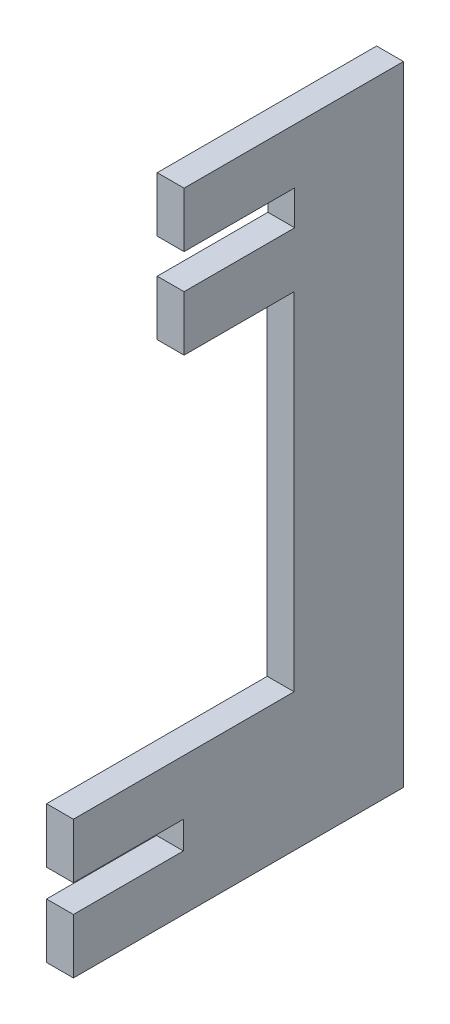
ISO-10303-21;
HEADER;
FILE_DESCRIPTION(('STEP AP214'),'2;1');
FILE_NAME('part.step','',(''),(''),'','','');
FILE_SCHEMA(('AUTOMOTIVE_DESIGN { 1 0 10303 214 1 1 1 1 }'));
ENDSEC;
DATA;
#1=APPLICATION_CONTEXT('core data for automotive mechanical design processes');
#2=APPLICATION_PROTOCOL_DEFINITION('international standard','automotive_design',2000,#1);
#3=PRODUCT_CONTEXT('',#1,'mechanical');
#4=PRODUCT('Part','Part','',(#3));
#5=PRODUCT_RELATED_PRODUCT_CATEGORY('part','',(#4));
#6=PRODUCT_DEFINITION_FORMATION('','',#4);
#7=PRODUCT_DEFINITION_CONTEXT('part definition',#1,'design');
#8=PRODUCT_DEFINITION('design','',#6,#7);
#9=PRODUCT_DEFINITION_SHAPE('','',#8);
#10=(LENGTH_UNIT() NAMED_UNIT(*) SI_UNIT(.MILLI.,.METRE.));
#11=(NAMED_UNIT(*) PLANE_ANGLE_UNIT() SI_UNIT($,.RADIAN.));
#12=(NAMED_UNIT(*) SI_UNIT($,.STERADIAN.) SOLID_ANGLE_UNIT());
#13=UNCERTAINTY_MEASURE_WITH_UNIT(LENGTH_MEASURE(1.E-05),#10,'distance_accuracy_value','');
#14=(GEOMETRIC_REPRESENTATION_CONTEXT(3) GLOBAL_UNCERTAINTY_ASSIGNED_CONTEXT((#13)) GLOBAL_UNIT_ASSIGNED_CONTEXT((#10,
#11,#12)) REPRESENTATION_CONTEXT('',''));
#15=CARTESIAN_POINT('',(0.,0.,0.));
#16=DIRECTION('',(0.,0.,1.));
#17=DIRECTION('',(1.,0.,0.));
#18=AXIS2_PLACEMENT_3D('',#15,#16,#17);
#19=CARTESIAN_POINT('',(3.0988,1.5875,12.7));
#20=DIRECTION('',(0.,0.,-1.));
#21=DIRECTION('',(0.,1.,0.));
#22=AXIS2_PLACEMENT_3D('',#19,#20,#21);
#23=PLANE('',#22);
#24=DIRECTION('',(0.,-1.,0.));
#25=VECTOR('',#24,1.);
#26=CARTESIAN_POINT('',(0.,1.5875,12.7));
#27=LINE('',#26,#25);
#28=CARTESIAN_POINT('',(0.,7.9375,12.7));
#29=VERTEX_POINT('',#28);
#30=CARTESIAN_POINT('',(0.,1.5875,12.7));
#31=VERTEX_POINT('',#30);
#32=EDGE_CURVE('E177',#29,#31,#27,.T.);
#33=ORIENTED_EDGE('',*,*,#32,.T.);
#34=DIRECTION('',(-1.,0.,0.));
#35=VECTOR('',#34,1.);
#36=CARTESIAN_POINT('',(3.0988,1.5875,12.7));
#37=LINE('',#36,#35);
#38=CARTESIAN_POINT('',(3.0988,1.5875,12.7));
#39=VERTEX_POINT('',#38);
#40=EDGE_CURVE('E11',#39,#31,#37,.T.);
#41=ORIENTED_EDGE('',*,*,#40,.F.);
#42=DIRECTION('',(0.,-1.,0.));
#43=VECTOR('',#42,1.);
#44=CARTESIAN_POINT('',(3.0988,1.5875,12.7));
#45=LINE('',#44,#43);
#46=CARTESIAN_POINT('',(3.0988,7.9375,12.7));
#47=VERTEX_POINT('',#46);
#48=EDGE_CURVE('E207',#47,#39,#45,.T.);
#49=ORIENTED_EDGE('',*,*,#48,.F.);
#50=DIRECTION('',(-1.,0.,0.));
#51=VECTOR('',#50,1.);
#52=CARTESIAN_POINT('',(3.0988,7.9375,12.7));
#53=LINE('',#52,#51);
#54=EDGE_CURVE('E173',#47,#29,#53,.T.);
#55=ORIENTED_EDGE('',*,*,#54,.T.);
#56=EDGE_LOOP('',(#33,#41,#49,#55));
#57=FACE_BOUND('',#56,.T.);
#58=ADVANCED_FACE('F33',(#57),#23,.F.);
#59=CARTESIAN_POINT('',(3.0988,1.5875,12.7));
#60=DIRECTION('',(0.,1.,0.));
#61=DIRECTION('',(0.,0.,1.));
#62=AXIS2_PLACEMENT_3D('',#59,#60,#61);
#63=PLANE('',#62);
#64=DIRECTION('',(0.,0.,-1.));
#65=VECTOR('',#64,1.);
#66=CARTESIAN_POINT('',(0.,1.5875,12.7));
#67=LINE('',#66,#65);
#68=CARTESIAN_POINT('',(0.,1.5875,0.));
#69=VERTEX_POINT('',#68);
#70=EDGE_CURVE('E180',#31,#69,#67,.T.);
#71=ORIENTED_EDGE('',*,*,#70,.T.);
#72=DIRECTION('',(-1.,0.,0.));
#73=VECTOR('',#72,1.);
#74=CARTESIAN_POINT('',(3.0988,1.5875,0.));
#75=LINE('',#74,#73);
#76=CARTESIAN_POINT('',(3.0988,1.5875,0.));
#77=VERTEX_POINT('',#76);
#78=EDGE_CURVE('E41',#77,#69,#75,.T.);
#79=ORIENTED_EDGE('',*,*,#78,.F.);
#80=DIRECTION('',(0.,0.,-1.));
#81=VECTOR('',#80,1.);
#82=CARTESIAN_POINT('',(3.0988,1.5875,12.7));
#83=LINE('',#82,#81);
#84=EDGE_CURVE('E116',#39,#77,#83,.T.);
#85=ORIENTED_EDGE('',*,*,#84,.F.);
#86=ORIENTED_EDGE('',*,*,#40,.T.);
#87=EDGE_LOOP('',(#71,#79,#85,#86));
#88=FACE_BOUND('',#87,.T.);
#89=ADVANCED_FACE('F305',(#88),#63,.F.);
#90=CARTESIAN_POINT('',(3.0988,1.5875,0.));
#91=DIRECTION('',(0.,0.,-1.));
#92=DIRECTION('',(0.,1.,0.));
#93=AXIS2_PLACEMENT_3D('',#90,#91,#92);
#94=PLANE('',#93);
#95=DIRECTION('',(0.,-1.,0.));
#96=VECTOR('',#95,1.);
#97=CARTESIAN_POINT('',(0.,1.5875,0.));
#98=LINE('',#97,#96);
#99=CARTESIAN_POINT('',(0.,-1.5875,0.));
#100=VERTEX_POINT('',#99);
#101=EDGE_CURVE('E182',#69,#100,#98,.T.);
#102=ORIENTED_EDGE('',*,*,#101,.T.);
#103=DIRECTION('',(-1.,0.,0.));
#104=VECTOR('',#103,1.);
#105=CARTESIAN_POINT('',(3.0988,-1.5875,0.));
#106=LINE('',#105,#104);
#107=CARTESIAN_POINT('',(3.0988,-1.5875,0.));
#108=VERTEX_POINT('',#107);
#109=EDGE_CURVE('E238',#108,#100,#106,.T.);
#110=ORIENTED_EDGE('',*,*,#109,.F.);
#111=DIRECTION('',(0.,-1.,0.));
#112=VECTOR('',#111,1.);
#113=CARTESIAN_POINT('',(3.0988,1.5875,0.));
#114=LINE('',#113,#112);
#115=EDGE_CURVE('E246',#77,#108,#114,.T.);
#116=ORIENTED_EDGE('',*,*,#115,.F.);
#117=ORIENTED_EDGE('',*,*,#78,.T.);
#118=EDGE_LOOP('',(#102,#110,#116,#117));
#119=FACE_BOUND('',#118,.T.);
#120=ADVANCED_FACE('F244',(#119),#94,.F.);
#121=CARTESIAN_POINT('',(3.0988,-1.5875,12.7));
#122=DIRECTION('',(0.,-1.,0.));
#123=DIRECTION('',(0.,0.,-1.));
#124=AXIS2_PLACEMENT_3D('',#121,#122,#123);
#125=PLANE('',#124);
#126=DIRECTION('',(0.,0.,1.));
#127=VECTOR('',#126,1.);
#128=CARTESIAN_POINT('',(0.,-1.5875,12.7));
#129=LINE('',#128,#127);
#130=CARTESIAN_POINT('',(0.,-1.5875,12.7));
#131=VERTEX_POINT('',#130);
#132=EDGE_CURVE('E184',#100,#131,#129,.T.);
#133=ORIENTED_EDGE('',*,*,#132,.T.);
#134=DIRECTION('',(-1.,0.,0.));
#135=VECTOR('',#134,1.);
#136=CARTESIAN_POINT('',(3.0988,-1.5875,12.7));
#137=LINE('',#136,#135);
#138=CARTESIAN_POINT('',(3.0988,-1.5875,12.7));
#139=VERTEX_POINT('',#138);
#140=EDGE_CURVE('E235',#139,#131,#137,.T.);
#141=ORIENTED_EDGE('',*,*,#140,.F.);
#142=DIRECTION('',(0.,0.,1.));
#143=VECTOR('',#142,1.);
#144=CARTESIAN_POINT('',(3.0988,-1.5875,12.7));
#145=LINE('',#144,#143);
#146=EDGE_CURVE('E264',#108,#139,#145,.T.);
#147=ORIENTED_EDGE('',*,*,#146,.F.);
#148=ORIENTED_EDGE('',*,*,#109,.T.);
#149=EDGE_LOOP('',(#133,#141,#147,#148));
#150=FACE_BOUND('',#149,.T.);
#151=ADVANCED_FACE('F255',(#150),#125,.F.);
#152=CARTESIAN_POINT('',(3.0988,-1.5875,12.7));
#153=DIRECTION('',(0.,0.,-1.));
#154=DIRECTION('',(-1.,0.,0.));
#155=AXIS2_PLACEMENT_3D('',#152,#153,#154);
#156=PLANE('',#155);
#157=DIRECTION('',(0.,-1.,0.));
#158=VECTOR('',#157,1.);
#159=CARTESIAN_POINT('',(0.,-1.5875,12.7));
#160=LINE('',#159,#158);
#161=CARTESIAN_POINT('',(0.,-7.9375,12.7));
#162=VERTEX_POINT('',#161);
#163=EDGE_CURVE('E186',#131,#162,#160,.T.);
#164=ORIENTED_EDGE('',*,*,#163,.T.);
#165=DIRECTION('',(-1.,0.,0.));
#166=VECTOR('',#165,1.);
#167=CARTESIAN_POINT('',(3.0988,-7.9375,12.7));
#168=LINE('',#167,#166);
#169=CARTESIAN_POINT('',(3.0988,-7.9375,12.7));
#170=VERTEX_POINT('',#169);
#171=EDGE_CURVE('E232',#170,#162,#168,.T.);
#172=ORIENTED_EDGE('',*,*,#171,.F.);
#173=DIRECTION('',(0.,-1.,0.));
#174=VECTOR('',#173,1.);
#175=CARTESIAN_POINT('',(3.0988,-1.5875,12.7));
#176=LINE('',#175,#174);
#177=EDGE_CURVE('E261',#139,#170,#176,.T.);
#178=ORIENTED_EDGE('',*,*,#177,.F.);
#179=ORIENTED_EDGE('',*,*,#140,.T.);
#180=EDGE_LOOP('',(#164,#172,#178,#179));
#181=FACE_BOUND('',#180,.T.);
#182=ADVANCED_FACE('F259',(#181),#156,.F.);
#183=CARTESIAN_POINT('',(3.0988,-7.9375,12.7));
#184=DIRECTION('',(0.,1.,0.));
#185=DIRECTION('',(0.,0.,1.));
#186=AXIS2_PLACEMENT_3D('',#183,#184,#185);
#187=PLANE('',#186);
#188=DIRECTION('',(0.,0.,-1.));
#189=VECTOR('',#188,1.);
#190=CARTESIAN_POINT('',(0.,-7.9375,12.7));
#191=LINE('',#190,#189);
#192=CARTESIAN_POINT('',(0.,-7.9375,-25.4));
#193=VERTEX_POINT('',#192);
#194=EDGE_CURVE('E188',#162,#193,#191,.T.);
#195=ORIENTED_EDGE('',*,*,#194,.T.);
#196=DIRECTION('',(-1.,0.,0.));
#197=VECTOR('',#196,1.);
#198=CARTESIAN_POINT('',(3.0988,-7.9375,-25.4));
#199=LINE('',#198,#197);
#200=CARTESIAN_POINT('',(3.0988,-7.9375,-25.4));
#201=VERTEX_POINT('',#200);
#202=EDGE_CURVE('E229',#201,#193,#199,.T.);
#203=ORIENTED_EDGE('',*,*,#202,.F.);
#204=DIRECTION('',(0.,0.,-1.));
#205=VECTOR('',#204,1.);
#206=CARTESIAN_POINT('',(3.0988,-7.9375,12.7));
#207=LINE('',#206,#205);
#208=EDGE_CURVE('E263',#170,#201,#207,.T.);
#209=ORIENTED_EDGE('',*,*,#208,.F.);
#210=ORIENTED_EDGE('',*,*,#171,.T.);
#211=EDGE_LOOP('',(#195,#203,#209,#210));
#212=FACE_BOUND('',#211,.T.);
#213=ADVANCED_FACE('F318',(#212),#187,.F.);
#214=CARTESIAN_POINT('',(3.0988,-7.9375,-25.4));
#215=DIRECTION('',(0.,0.,1.));
#216=DIRECTION('',(1.,0.,0.));
#217=AXIS2_PLACEMENT_3D('',#214,#215,#216);
#218=PLANE('',#217);
#219=DIRECTION('',(0.,1.,0.));
#220=VECTOR('',#219,1.);
#221=CARTESIAN_POINT('',(0.,-7.9375,-25.4));
#222=LINE('',#221,#220);
#223=CARTESIAN_POINT('',(0.,64.6375,-25.4));
#224=VERTEX_POINT('',#223);
#225=EDGE_CURVE('E190',#193,#224,#222,.T.);
#226=ORIENTED_EDGE('',*,*,#225,.T.);
#227=DIRECTION('',(-1.,0.,0.));
#228=VECTOR('',#227,1.);
#229=CARTESIAN_POINT('',(3.0988,64.6375,-25.4));
#230=LINE('',#229,#228);
#231=CARTESIAN_POINT('',(3.0988,64.6375,-25.4));
#232=VERTEX_POINT('',#231);
#233=EDGE_CURVE('E226',#232,#224,#230,.T.);
#234=ORIENTED_EDGE('',*,*,#233,.F.);
#235=DIRECTION('',(0.,1.,0.));
#236=VECTOR('',#235,1.);
#237=CARTESIAN_POINT('',(3.0988,-7.9375,-25.4));
#238=LINE('',#237,#236);
#239=EDGE_CURVE('E266',#201,#232,#238,.T.);
#240=ORIENTED_EDGE('',*,*,#239,.F.);
#241=ORIENTED_EDGE('',*,*,#202,.T.);
#242=EDGE_LOOP('',(#226,#234,#240,#241));
#243=FACE_BOUND('',#242,.T.);
#244=ADVANCED_FACE('F321',(#243),#218,.F.);
#245=CARTESIAN_POINT('',(3.0988,64.6375,-25.4));
#246=DIRECTION('',(0.,-1.,0.));
#247=DIRECTION('',(0.,0.,-1.));
#248=AXIS2_PLACEMENT_3D('',#245,#246,#247);
#249=PLANE('',#248);
#250=DIRECTION('',(0.,0.,1.));
#251=VECTOR('',#250,1.);
#252=CARTESIAN_POINT('',(0.,64.6375,-25.4));
#253=LINE('',#252,#251);
#254=CARTESIAN_POINT('',(0.,64.6375,-0.0761999999999806));
#255=VERTEX_POINT('',#254);
#256=EDGE_CURVE('E192',#224,#255,#253,.T.);
#257=ORIENTED_EDGE('',*,*,#256,.T.);
#258=DIRECTION('',(-1.,0.,0.));
#259=VECTOR('',#258,1.);
#260=CARTESIAN_POINT('',(3.0988,64.6375,-0.0761999999999806));
#261=LINE('',#260,#259);
#262=CARTESIAN_POINT('',(3.0988,64.6375,-0.0761999999999806));
#263=VERTEX_POINT('',#262);
#264=EDGE_CURVE('E223',#263,#255,#261,.T.);
#265=ORIENTED_EDGE('',*,*,#264,.F.);
#266=DIRECTION('',(0.,0.,1.));
#267=VECTOR('',#266,1.);
#268=CARTESIAN_POINT('',(3.0988,64.6375,-25.4));
#269=LINE('',#268,#267);
#270=EDGE_CURVE('E272',#232,#263,#269,.T.);
#271=ORIENTED_EDGE('',*,*,#270,.F.);
#272=ORIENTED_EDGE('',*,*,#233,.T.);
#273=EDGE_LOOP('',(#257,#265,#271,#272));
#274=FACE_BOUND('',#273,.T.);
#275=ADVANCED_FACE('F325',(#274),#249,.F.);
#276=CARTESIAN_POINT('',(3.0988,64.6375,-0.0761999999999806));
#277=DIRECTION('',(0.,0.,-1.));
#278=DIRECTION('',(0.,1.,0.));
#279=AXIS2_PLACEMENT_3D('',#276,#277,#278);
#280=PLANE('',#279);
#281=DIRECTION('',(0.,-1.,0.));
#282=VECTOR('',#281,1.);
#283=CARTESIAN_POINT('',(0.,64.6375,-0.0761999999999806));
#284=LINE('',#283,#282);
#285=CARTESIAN_POINT('',(0.,58.2875,-0.0761999999999826));
#286=VERTEX_POINT('',#285);
#287=EDGE_CURVE('E194',#255,#286,#284,.T.);
#288=ORIENTED_EDGE('',*,*,#287,.T.);
#289=DIRECTION('',(-1.,0.,0.));
#290=VECTOR('',#289,1.);
#291=CARTESIAN_POINT('',(3.0988,58.2875,-0.0761999999999826));
#292=LINE('',#291,#290);
#293=CARTESIAN_POINT('',(3.0988,58.2875,-0.0761999999999826));
#294=VERTEX_POINT('',#293);
#295=EDGE_CURVE('E220',#294,#286,#292,.T.);
#296=ORIENTED_EDGE('',*,*,#295,.F.);
#297=DIRECTION('',(0.,-1.,0.));
#298=VECTOR('',#297,1.);
#299=CARTESIAN_POINT('',(3.0988,64.6375,-0.0761999999999806));
#300=LINE('',#299,#298);
#301=EDGE_CURVE('E274',#263,#294,#300,.T.);
#302=ORIENTED_EDGE('',*,*,#301,.F.);
#303=ORIENTED_EDGE('',*,*,#264,.T.);
#304=EDGE_LOOP('',(#288,#296,#302,#303));
#305=FACE_BOUND('',#304,.T.);
#306=ADVANCED_FACE('F329',(#305),#280,.F.);
#307=CARTESIAN_POINT('',(3.0988,58.2875,-0.0761999999999826));
#308=DIRECTION('',(0.,1.,0.));
#309=DIRECTION('',(0.,0.,1.));
#310=AXIS2_PLACEMENT_3D('',#307,#308,#309);
#311=PLANE('',#310);
#312=DIRECTION('',(0.,0.,-1.));
#313=VECTOR('',#312,1.);
#314=CARTESIAN_POINT('',(0.,58.2875,-0.0761999999999826));
#315=LINE('',#314,#313);
#316=CARTESIAN_POINT('',(0.,58.2875,-12.8524));
#317=VERTEX_POINT('',#316);
#318=EDGE_CURVE('E196',#286,#317,#315,.T.);
#319=ORIENTED_EDGE('',*,*,#318,.T.);
#320=DIRECTION('',(-1.,0.,0.));
#321=VECTOR('',#320,1.);
#322=CARTESIAN_POINT('',(3.0988,58.2875,-12.8524));
#323=LINE('',#322,#321);
#324=CARTESIAN_POINT('',(3.0988,58.2875,-12.8524));
#325=VERTEX_POINT('',#324);
#326=EDGE_CURVE('E217',#325,#317,#323,.T.);
#327=ORIENTED_EDGE('',*,*,#326,.F.);
#328=DIRECTION('',(0.,0.,-1.));
#329=VECTOR('',#328,1.);
#330=CARTESIAN_POINT('',(3.0988,58.2875,-0.0761999999999826));
#331=LINE('',#330,#329);
#332=EDGE_CURVE('E276',#294,#325,#331,.T.);
#333=ORIENTED_EDGE('',*,*,#332,.F.);
#334=ORIENTED_EDGE('',*,*,#295,.T.);
#335=EDGE_LOOP('',(#319,#327,#333,#334));
#336=FACE_BOUND('',#335,.T.);
#337=ADVANCED_FACE('F333',(#336),#311,.F.);
#338=CARTESIAN_POINT('',(3.0988,58.2875,-12.8524));
#339=DIRECTION('',(0.,0.,-1.));
#340=DIRECTION('',(0.,1.,0.));
#341=AXIS2_PLACEMENT_3D('',#338,#339,#340);
#342=PLANE('',#341);
#343=DIRECTION('',(0.,-1.,0.));
#344=VECTOR('',#343,1.);
#345=CARTESIAN_POINT('',(0.,58.2875,-12.8524));
#346=LINE('',#345,#344);
#347=CARTESIAN_POINT('',(0.,54.2875,-12.8524));
#348=VERTEX_POINT('',#347);
#349=EDGE_CURVE('E198',#317,#348,#346,.T.);
#350=ORIENTED_EDGE('',*,*,#349,.T.);
#351=DIRECTION('',(-1.,0.,0.));
#352=VECTOR('',#351,1.);
#353=CARTESIAN_POINT('',(3.0988,54.2875,-12.8524));
#354=LINE('',#353,#352);
#355=CARTESIAN_POINT('',(3.0988,54.2875,-12.8524));
#356=VERTEX_POINT('',#355);
#357=EDGE_CURVE('E214',#356,#348,#354,.T.);
#358=ORIENTED_EDGE('',*,*,#357,.F.);
#359=DIRECTION('',(0.,-1.,0.));
#360=VECTOR('',#359,1.);
#361=CARTESIAN_POINT('',(3.0988,58.2875,-12.8524));
#362=LINE('',#361,#360);
#363=EDGE_CURVE('E278',#325,#356,#362,.T.);
#364=ORIENTED_EDGE('',*,*,#363,.F.);
#365=ORIENTED_EDGE('',*,*,#326,.T.);
#366=EDGE_LOOP('',(#350,#358,#364,#365));
#367=FACE_BOUND('',#366,.T.);
#368=ADVANCED_FACE('F337',(#367),#342,.F.);
#369=CARTESIAN_POINT('',(3.0988,54.2875,-12.8524));
#370=DIRECTION('',(0.,-1.,0.));
#371=DIRECTION('',(0.,0.,-1.));
#372=AXIS2_PLACEMENT_3D('',#369,#370,#371);
#373=PLANE('',#372);
#374=DIRECTION('',(0.,0.,1.));
#375=VECTOR('',#374,1.);
#376=CARTESIAN_POINT('',(0.,54.2875,-12.8524));
#377=LINE('',#376,#375);
#378=CARTESIAN_POINT('',(0.,54.2875,-0.0761999999999817));
#379=VERTEX_POINT('',#378);
#380=EDGE_CURVE('E200',#348,#379,#377,.T.);
#381=ORIENTED_EDGE('',*,*,#380,.T.);
#382=DIRECTION('',(-1.,0.,0.));
#383=VECTOR('',#382,1.);
#384=CARTESIAN_POINT('',(3.0988,54.2875,-0.0761999999999817));
#385=LINE('',#384,#383);
#386=CARTESIAN_POINT('',(3.0988,54.2875,-0.0761999999999817));
#387=VERTEX_POINT('',#386);
#388=EDGE_CURVE('E211',#387,#379,#385,.T.);
#389=ORIENTED_EDGE('',*,*,#388,.F.);
#390=DIRECTION('',(0.,0.,1.));
#391=VECTOR('',#390,1.);
#392=CARTESIAN_POINT('',(3.0988,54.2875,-12.8524));
#393=LINE('',#392,#391);
#394=EDGE_CURVE('E280',#356,#387,#393,.T.);
#395=ORIENTED_EDGE('',*,*,#394,.F.);
#396=ORIENTED_EDGE('',*,*,#357,.T.);
#397=EDGE_LOOP('',(#381,#389,#395,#396));
#398=FACE_BOUND('',#397,.T.);
#399=ADVANCED_FACE('F286',(#398),#373,.F.);
#400=CARTESIAN_POINT('',(3.0988,54.2875,-0.0761999999999817));
#401=DIRECTION('',(0.,0.,-1.));
#402=DIRECTION('',(0.,1.,0.));
#403=AXIS2_PLACEMENT_3D('',#400,#401,#402);
#404=PLANE('',#403);
#405=DIRECTION('',(0.,-1.,0.));
#406=VECTOR('',#405,1.);
#407=CARTESIAN_POINT('',(0.,54.2875,-0.0761999999999817));
#408=LINE('',#407,#406);
#409=CARTESIAN_POINT('',(0.,47.9375,-0.0761999999999837));
#410=VERTEX_POINT('',#409);
#411=EDGE_CURVE('E202',#379,#410,#408,.T.);
#412=ORIENTED_EDGE('',*,*,#411,.T.);
#413=DIRECTION('',(-1.,0.,0.));
#414=VECTOR('',#413,1.);
#415=CARTESIAN_POINT('',(3.0988,47.9375,-0.0761999999999837));
#416=LINE('',#415,#414);
#417=CARTESIAN_POINT('',(3.0988,47.9375,-0.0761999999999837));
#418=VERTEX_POINT('',#417);
#419=EDGE_CURVE('E168',#418,#410,#416,.T.);
#420=ORIENTED_EDGE('',*,*,#419,.F.);
#421=DIRECTION('',(0.,-1.,0.));
#422=VECTOR('',#421,1.);
#423=CARTESIAN_POINT('',(3.0988,54.2875,-0.0761999999999817));
#424=LINE('',#423,#422);
#425=EDGE_CURVE('E159',#387,#418,#424,.T.);
#426=ORIENTED_EDGE('',*,*,#425,.F.);
#427=ORIENTED_EDGE('',*,*,#388,.T.);
#428=EDGE_LOOP('',(#412,#420,#426,#427));
#429=FACE_BOUND('',#428,.T.);
#430=ADVANCED_FACE('F290',(#429),#404,.F.);
#431=CARTESIAN_POINT('',(3.0988,47.9375,-12.7762));
#432=DIRECTION('',(0.,1.,0.));
#433=DIRECTION('',(0.,0.,1.));
#434=AXIS2_PLACEMENT_3D('',#431,#432,#433);
#435=PLANE('',#434);
#436=DIRECTION('',(0.,0.,-1.));
#437=VECTOR('',#436,1.);
#438=CARTESIAN_POINT('',(0.,47.9375,-12.7762));
#439=LINE('',#438,#437);
#440=CARTESIAN_POINT('',(0.,47.9375,-12.7762));
#441=VERTEX_POINT('',#440);
#442=EDGE_CURVE('E167',#410,#441,#439,.T.);
#443=ORIENTED_EDGE('',*,*,#442,.T.);
#444=DIRECTION('',(-1.,0.,0.));
#445=VECTOR('',#444,1.);
#446=CARTESIAN_POINT('',(3.0988,47.9375,-12.7762));
#447=LINE('',#446,#445);
#448=CARTESIAN_POINT('',(3.0988,47.9375,-12.7762));
#449=VERTEX_POINT('',#448);
#450=EDGE_CURVE('E164',#449,#441,#447,.T.);
#451=ORIENTED_EDGE('',*,*,#450,.F.);
#452=DIRECTION('',(0.,0.,-1.));
#453=VECTOR('',#452,1.);
#454=CARTESIAN_POINT('',(3.0988,47.9375,-12.7762));
#455=LINE('',#454,#453);
#456=EDGE_CURVE('E153',#418,#449,#455,.T.);
#457=ORIENTED_EDGE('',*,*,#456,.F.);
#458=ORIENTED_EDGE('',*,*,#419,.T.);
#459=EDGE_LOOP('',(#443,#451,#457,#458));
#460=FACE_BOUND('',#459,.T.);
#461=ADVANCED_FACE('F165',(#460),#435,.F.);
#462=CARTESIAN_POINT('',(3.0988,7.9375,-12.7762));
#463=DIRECTION('',(0.,0.,-1.));
#464=DIRECTION('',(0.,1.,0.));
#465=AXIS2_PLACEMENT_3D('',#462,#463,#464);
#466=PLANE('',#465);
#467=DIRECTION('',(0.,-1.,0.));
#468=VECTOR('',#467,1.);
#469=CARTESIAN_POINT('',(0.,7.9375,-12.7762));
#470=LINE('',#469,#468);
#471=CARTESIAN_POINT('',(0.,7.9375,-12.7762));
#472=VERTEX_POINT('',#471);
#473=EDGE_CURVE('E102',#441,#472,#470,.T.);
#474=ORIENTED_EDGE('',*,*,#473,.T.);
#475=DIRECTION('',(-1.,0.,0.));
#476=VECTOR('',#475,1.);
#477=CARTESIAN_POINT('',(3.0988,7.9375,-12.7762));
#478=LINE('',#477,#476);
#479=CARTESIAN_POINT('',(3.0988,7.9375,-12.7762));
#480=VERTEX_POINT('',#479);
#481=EDGE_CURVE('E169',#480,#472,#478,.T.);
#482=ORIENTED_EDGE('',*,*,#481,.F.);
#483=DIRECTION('',(0.,-1.,0.));
#484=VECTOR('',#483,1.);
#485=CARTESIAN_POINT('',(3.0988,7.9375,-12.7762));
#486=LINE('',#485,#484);
#487=EDGE_CURVE('E157',#449,#480,#486,.T.);
#488=ORIENTED_EDGE('',*,*,#487,.F.);
#489=ORIENTED_EDGE('',*,*,#450,.T.);
#490=EDGE_LOOP('',(#474,#482,#488,#489));
#491=FACE_BOUND('',#490,.T.);
#492=ADVANCED_FACE('F171',(#491),#466,.F.);
#493=CARTESIAN_POINT('',(3.0988,7.9375,12.7));
#494=DIRECTION('',(0.,-1.,0.));
#495=DIRECTION('',(0.,0.,-1.));
#496=AXIS2_PLACEMENT_3D('',#493,#494,#495);
#497=PLANE('',#496);
#498=DIRECTION('',(0.,0.,1.));
#499=VECTOR('',#498,1.);
#500=CARTESIAN_POINT('',(0.,7.9375,12.7));
#501=LINE('',#500,#499);
#502=EDGE_CURVE('E108',#472,#29,#501,.T.);
#503=ORIENTED_EDGE('',*,*,#502,.T.);
#504=ORIENTED_EDGE('',*,*,#54,.F.);
#505=DIRECTION('',(0.,0.,1.));
#506=VECTOR('',#505,1.);
#507=CARTESIAN_POINT('',(3.0988,7.9375,12.7));
#508=LINE('',#507,#506);
#509=EDGE_CURVE('E49',#480,#47,#508,.T.);
#510=ORIENTED_EDGE('',*,*,#509,.F.);
#511=ORIENTED_EDGE('',*,*,#481,.T.);
#512=EDGE_LOOP('',(#503,#504,#510,#511));
#513=FACE_BOUND('',#512,.T.);
#514=ADVANCED_FACE('F294',(#513),#497,.F.);
#515=CARTESIAN_POINT('',(3.0988,0.,0.));
#516=DIRECTION('',(-1.,0.,0.));
#517=DIRECTION('',(0.,0.,1.));
#518=AXIS2_PLACEMENT_3D('',#515,#516,#517);
#519=PLANE('',#518);
#520=ORIENTED_EDGE('',*,*,#48,.T.);
#521=ORIENTED_EDGE('',*,*,#84,.T.);
#522=ORIENTED_EDGE('',*,*,#115,.T.);
#523=ORIENTED_EDGE('',*,*,#146,.T.);
#524=ORIENTED_EDGE('',*,*,#177,.T.);
#525=ORIENTED_EDGE('',*,*,#208,.T.);
#526=ORIENTED_EDGE('',*,*,#239,.T.);
#527=ORIENTED_EDGE('',*,*,#270,.T.);
#528=ORIENTED_EDGE('',*,*,#301,.T.);
#529=ORIENTED_EDGE('',*,*,#332,.T.);
#530=ORIENTED_EDGE('',*,*,#363,.T.);
#531=ORIENTED_EDGE('',*,*,#394,.T.);
#532=ORIENTED_EDGE('',*,*,#425,.T.);
#533=ORIENTED_EDGE('',*,*,#456,.T.);
#534=ORIENTED_EDGE('',*,*,#487,.T.);
#535=ORIENTED_EDGE('',*,*,#509,.T.);
#536=EDGE_LOOP('',(#520,#521,#522,#523,#524,#525,#526,#527,#528,#529,#530,#531,#532,#533,#534,#535));
#537=FACE_BOUND('',#536,.T.);
#538=ADVANCED_FACE('F155',(#537),#519,.F.);
#539=CARTESIAN_POINT('',(0.,0.,0.));
#540=DIRECTION('',(-1.,0.,0.));
#541=DIRECTION('',(0.,0.,1.));
#542=AXIS2_PLACEMENT_3D('',#539,#540,#541);
#543=PLANE('',#542);
#544=ORIENTED_EDGE('',*,*,#32,.F.);
#545=ORIENTED_EDGE('',*,*,#502,.F.);
#546=ORIENTED_EDGE('',*,*,#473,.F.);
#547=ORIENTED_EDGE('',*,*,#442,.F.);
#548=ORIENTED_EDGE('',*,*,#411,.F.);
#549=ORIENTED_EDGE('',*,*,#380,.F.);
#550=ORIENTED_EDGE('',*,*,#349,.F.);
#551=ORIENTED_EDGE('',*,*,#318,.F.);
#552=ORIENTED_EDGE('',*,*,#287,.F.);
#553=ORIENTED_EDGE('',*,*,#256,.F.);
#554=ORIENTED_EDGE('',*,*,#225,.F.);
#555=ORIENTED_EDGE('',*,*,#194,.F.);
#556=ORIENTED_EDGE('',*,*,#163,.F.);
#557=ORIENTED_EDGE('',*,*,#132,.F.);
#558=ORIENTED_EDGE('',*,*,#101,.F.);
#559=ORIENTED_EDGE('',*,*,#70,.F.);
#560=EDGE_LOOP('',(#544,#545,#546,#547,#548,#549,#550,#551,#552,#553,#554,#555,#556,#557,#558,#559));
#561=FACE_BOUND('',#560,.T.);
#562=ADVANCED_FACE('F250',(#561),#543,.T.);
#563=CLOSED_SHELL('',(#58,#89,#120,#151,#182,#213,#244,#275,#306,#337,#368,#399,#430,#461,#492,
#514,#538,#562));
#564=MANIFOLD_SOLID_BREP('B2',#563);
#565=ADVANCED_BREP_SHAPE_REPRESENTATION('',(#18,#564),#14);
#566=SHAPE_DEFINITION_REPRESENTATION(#9,#565);
ENDSEC;
END-ISO-10303-21;
